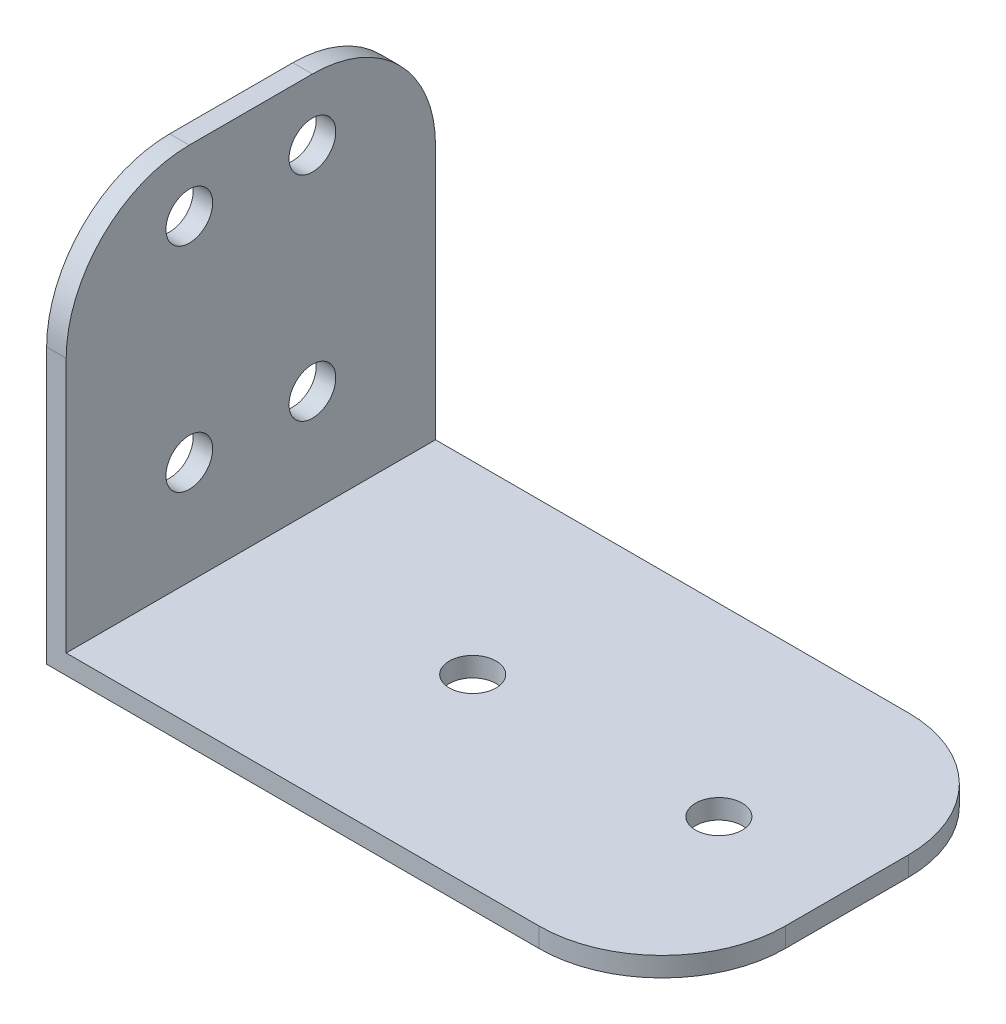
ISO-10303-21;
HEADER;
FILE_DESCRIPTION(('STEP AP214'),'2;1');
FILE_NAME('part.step','',(''),(''),'','','');
FILE_SCHEMA(('AUTOMOTIVE_DESIGN { 1 0 10303 214 1 1 1 1 }'));
ENDSEC;
DATA;
#1=APPLICATION_CONTEXT('core data for automotive mechanical design processes');
#2=APPLICATION_PROTOCOL_DEFINITION('international standard','automotive_design',2000,#1);
#3=PRODUCT_CONTEXT('',#1,'mechanical');
#4=PRODUCT('Part','Part','',(#3));
#5=PRODUCT_RELATED_PRODUCT_CATEGORY('part','',(#4));
#6=PRODUCT_DEFINITION_FORMATION('','',#4);
#7=PRODUCT_DEFINITION_CONTEXT('part definition',#1,'design');
#8=PRODUCT_DEFINITION('design','',#6,#7);
#9=PRODUCT_DEFINITION_SHAPE('','',#8);
#10=(LENGTH_UNIT() NAMED_UNIT(*) SI_UNIT(.MILLI.,.METRE.));
#11=(NAMED_UNIT(*) PLANE_ANGLE_UNIT() SI_UNIT($,.RADIAN.));
#12=(NAMED_UNIT(*) SI_UNIT($,.STERADIAN.) SOLID_ANGLE_UNIT());
#13=UNCERTAINTY_MEASURE_WITH_UNIT(LENGTH_MEASURE(1.E-05),#10,'distance_accuracy_value','');
#14=(GEOMETRIC_REPRESENTATION_CONTEXT(3) GLOBAL_UNCERTAINTY_ASSIGNED_CONTEXT((#13)) GLOBAL_UNIT_ASSIGNED_CONTEXT((#10,
#11,#12)) REPRESENTATION_CONTEXT('',''));
#15=CARTESIAN_POINT('',(0.,0.,0.));
#16=DIRECTION('',(0.,0.,1.));
#17=DIRECTION('',(1.,0.,0.));
#18=AXIS2_PLACEMENT_3D('',#15,#16,#17);
#19=CARTESIAN_POINT('',(0.,0.,15.));
#20=DIRECTION('',(1.,0.,0.));
#21=DIRECTION('',(0.,0.,-1.));
#22=AXIS2_PLACEMENT_3D('',#19,#20,#21);
#23=PLANE('',#22);
#24=CARTESIAN_POINT('',(0.,27.32,-5.));
#25=DIRECTION('',(-1.,0.,0.));
#26=DIRECTION('',(0.,0.,1.));
#27=AXIS2_PLACEMENT_3D('',#24,#25,#26);
#28=CIRCLE('',#27,1.89864999999999);
#29=CARTESIAN_POINT('',(0.,27.32,-3.10135000000001));
#30=VERTEX_POINT('',#29);
#31=EDGE_CURVE('E289',#30,#30,#28,.T.);
#32=ORIENTED_EDGE('',*,*,#31,.F.);
#33=EDGE_LOOP('',(#32));
#34=FACE_BOUND('',#33,.T.);
#35=CARTESIAN_POINT('',(0.,10.,5.));
#36=DIRECTION('',(-1.,0.,0.));
#37=DIRECTION('',(0.,0.,1.));
#38=AXIS2_PLACEMENT_3D('',#35,#36,#37);
#39=CIRCLE('',#38,1.89864999999999);
#40=CARTESIAN_POINT('',(0.,10.,6.89864999999999));
#41=VERTEX_POINT('',#40);
#42=EDGE_CURVE('E293',#41,#41,#39,.T.);
#43=ORIENTED_EDGE('',*,*,#42,.F.);
#44=EDGE_LOOP('',(#43));
#45=FACE_BOUND('',#44,.T.);
#46=CARTESIAN_POINT('',(0.,27.32,5.));
#47=DIRECTION('',(-1.,0.,0.));
#48=DIRECTION('',(0.,0.,1.));
#49=AXIS2_PLACEMENT_3D('',#46,#47,#48);
#50=CIRCLE('',#49,1.89864999999999);
#51=CARTESIAN_POINT('',(0.,27.32,6.89864999999999));
#52=VERTEX_POINT('',#51);
#53=EDGE_CURVE('E299',#52,#52,#50,.T.);
#54=ORIENTED_EDGE('',*,*,#53,.F.);
#55=EDGE_LOOP('',(#54));
#56=FACE_BOUND('',#55,.T.);
#57=CARTESIAN_POINT('',(0.,10.,-5.));
#58=DIRECTION('',(-1.,0.,0.));
#59=DIRECTION('',(0.,0.,1.));
#60=AXIS2_PLACEMENT_3D('',#57,#58,#59);
#61=CIRCLE('',#60,1.89864999999999);
#62=CARTESIAN_POINT('',(0.,10.,-3.10135000000001));
#63=VERTEX_POINT('',#62);
#64=EDGE_CURVE('E305',#63,#63,#61,.T.);
#65=ORIENTED_EDGE('',*,*,#64,.F.);
#66=EDGE_LOOP('',(#65));
#67=FACE_BOUND('',#66,.T.);
#68=DIRECTION('',(0.,-1.,0.));
#69=VECTOR('',#68,1.);
#70=CARTESIAN_POINT('',(0.,0.,15.));
#71=LINE('',#70,#69);
#72=CARTESIAN_POINT('',(0.,22.32,15.));
#73=VERTEX_POINT('',#72);
#74=CARTESIAN_POINT('',(0.,0.,15.));
#75=VERTEX_POINT('',#74);
#76=EDGE_CURVE('E113',#73,#75,#71,.T.);
#77=ORIENTED_EDGE('',*,*,#76,.F.);
#78=CARTESIAN_POINT('',(0.,22.32,5.));
#79=DIRECTION('',(1.,0.,0.));
#80=DIRECTION('',(0.,0.,-1.));
#81=AXIS2_PLACEMENT_3D('',#78,#79,#80);
#82=CIRCLE('',#81,10.);
#83=CARTESIAN_POINT('',(0.,32.32,5.));
#84=VERTEX_POINT('',#83);
#85=EDGE_CURVE('E167',#73,#84,#82,.F.);
#86=ORIENTED_EDGE('',*,*,#85,.T.);
#87=DIRECTION('',(0.,0.,-1.));
#88=VECTOR('',#87,1.);
#89=CARTESIAN_POINT('',(0.,32.32,15.));
#90=LINE('',#89,#88);
#91=CARTESIAN_POINT('',(0.,32.32,-5.));
#92=VERTEX_POINT('',#91);
#93=EDGE_CURVE('E175',#84,#92,#90,.T.);
#94=ORIENTED_EDGE('',*,*,#93,.T.);
#95=CARTESIAN_POINT('',(0.,22.32,-5.));
#96=DIRECTION('',(1.,0.,0.));
#97=DIRECTION('',(0.,0.,-1.));
#98=AXIS2_PLACEMENT_3D('',#95,#96,#97);
#99=CIRCLE('',#98,10.);
#100=CARTESIAN_POINT('',(0.,22.32,-15.));
#101=VERTEX_POINT('',#100);
#102=EDGE_CURVE('E165',#92,#101,#99,.F.);
#103=ORIENTED_EDGE('',*,*,#102,.T.);
#104=DIRECTION('',(0.,-1.,0.));
#105=VECTOR('',#104,1.);
#106=CARTESIAN_POINT('',(0.,0.,-15.));
#107=LINE('',#106,#105);
#108=CARTESIAN_POINT('',(0.,0.,-15.));
#109=VERTEX_POINT('',#108);
#110=EDGE_CURVE('E137',#101,#109,#107,.T.);
#111=ORIENTED_EDGE('',*,*,#110,.T.);
#112=DIRECTION('',(0.,0.,-1.));
#113=VECTOR('',#112,1.);
#114=CARTESIAN_POINT('',(0.,0.,15.));
#115=LINE('',#114,#113);
#116=EDGE_CURVE('E130',#75,#109,#115,.T.);
#117=ORIENTED_EDGE('',*,*,#116,.F.);
#118=EDGE_LOOP('',(#77,#86,#94,#103,#111,#117));
#119=FACE_BOUND('',#118,.T.);
#120=ADVANCED_FACE('F35',(#34,#45,#56,#67,#119),#23,.F.);
#121=CARTESIAN_POINT('',(0.,0.,15.));
#122=DIRECTION('',(0.,1.,0.));
#123=DIRECTION('',(0.,0.,1.));
#124=AXIS2_PLACEMENT_3D('',#121,#122,#123);
#125=PLANE('',#124);
#126=CARTESIAN_POINT('',(19.61,0.,0.));
#127=DIRECTION('',(0.,-1.,0.));
#128=DIRECTION('',(0.,0.,-1.));
#129=AXIS2_PLACEMENT_3D('',#126,#127,#128);
#130=CIRCLE('',#129,1.89864999999999);
#131=CARTESIAN_POINT('',(19.61,0.,-1.89864999999999));
#132=VERTEX_POINT('',#131);
#133=EDGE_CURVE('E276',#132,#132,#130,.T.);
#134=ORIENTED_EDGE('',*,*,#133,.F.);
#135=EDGE_LOOP('',(#134));
#136=FACE_BOUND('',#135,.T.);
#137=CARTESIAN_POINT('',(39.61,0.,0.));
#138=DIRECTION('',(0.,-1.,0.));
#139=DIRECTION('',(0.,0.,-1.));
#140=AXIS2_PLACEMENT_3D('',#137,#138,#139);
#141=CIRCLE('',#140,1.89864999999999);
#142=CARTESIAN_POINT('',(39.61,0.,-1.89864999999999));
#143=VERTEX_POINT('',#142);
#144=EDGE_CURVE('E280',#143,#143,#141,.T.);
#145=ORIENTED_EDGE('',*,*,#144,.F.);
#146=EDGE_LOOP('',(#145));
#147=FACE_BOUND('',#146,.T.);
#148=DIRECTION('',(1.,0.,0.));
#149=VECTOR('',#148,1.);
#150=CARTESIAN_POINT('',(0.,0.,-15.));
#151=LINE('',#150,#149);
#152=CARTESIAN_POINT('',(40.,0.,-15.));
#153=VERTEX_POINT('',#152);
#154=EDGE_CURVE('E204',#109,#153,#151,.T.);
#155=ORIENTED_EDGE('',*,*,#154,.T.);
#156=CARTESIAN_POINT('',(40.,0.,-5.));
#157=DIRECTION('',(0.,1.,0.));
#158=DIRECTION('',(0.,0.,1.));
#159=AXIS2_PLACEMENT_3D('',#156,#157,#158);
#160=CIRCLE('',#159,10.);
#161=CARTESIAN_POINT('',(50.,0.,-5.));
#162=VERTEX_POINT('',#161);
#163=EDGE_CURVE('E160',#153,#162,#160,.F.);
#164=ORIENTED_EDGE('',*,*,#163,.T.);
#165=DIRECTION('',(0.,0.,-1.));
#166=VECTOR('',#165,1.);
#167=CARTESIAN_POINT('',(50.,0.,15.));
#168=LINE('',#167,#166);
#169=CARTESIAN_POINT('',(50.,0.,5.));
#170=VERTEX_POINT('',#169);
#171=EDGE_CURVE('E140',#170,#162,#168,.T.);
#172=ORIENTED_EDGE('',*,*,#171,.F.);
#173=CARTESIAN_POINT('',(40.,0.,5.));
#174=DIRECTION('',(0.,1.,0.));
#175=DIRECTION('',(0.,0.,1.));
#176=AXIS2_PLACEMENT_3D('',#173,#174,#175);
#177=CIRCLE('',#176,10.);
#178=CARTESIAN_POINT('',(40.,0.,15.));
#179=VERTEX_POINT('',#178);
#180=EDGE_CURVE('E133',#170,#179,#177,.F.);
#181=ORIENTED_EDGE('',*,*,#180,.T.);
#182=DIRECTION('',(1.,0.,0.));
#183=VECTOR('',#182,1.);
#184=CARTESIAN_POINT('',(0.,0.,15.));
#185=LINE('',#184,#183);
#186=EDGE_CURVE('E117',#75,#179,#185,.T.);
#187=ORIENTED_EDGE('',*,*,#186,.F.);
#188=ORIENTED_EDGE('',*,*,#116,.T.);
#189=EDGE_LOOP('',(#155,#164,#172,#181,#187,#188));
#190=FACE_BOUND('',#189,.T.);
#191=ADVANCED_FACE('F129',(#136,#147,#190),#125,.F.);
#192=CARTESIAN_POINT('',(50.,1.5875,15.));
#193=DIRECTION('',(-1.,0.,0.));
#194=DIRECTION('',(0.,0.,1.));
#195=AXIS2_PLACEMENT_3D('',#192,#193,#194);
#196=PLANE('',#195);
#197=ORIENTED_EDGE('',*,*,#171,.T.);
#198=DIRECTION('',(0.,1.,0.));
#199=VECTOR('',#198,1.);
#200=CARTESIAN_POINT('',(50.,1.5875,-5.));
#201=LINE('',#200,#199);
#202=CARTESIAN_POINT('',(50.,1.5875,-5.));
#203=VERTEX_POINT('',#202);
#204=EDGE_CURVE('E142',#162,#203,#201,.T.);
#205=ORIENTED_EDGE('',*,*,#204,.T.);
#206=DIRECTION('',(0.,0.,-1.));
#207=VECTOR('',#206,1.);
#208=CARTESIAN_POINT('',(50.,1.5875,15.));
#209=LINE('',#208,#207);
#210=CARTESIAN_POINT('',(50.,1.5875,5.));
#211=VERTEX_POINT('',#210);
#212=EDGE_CURVE('E145',#211,#203,#209,.T.);
#213=ORIENTED_EDGE('',*,*,#212,.F.);
#214=DIRECTION('',(0.,1.,0.));
#215=VECTOR('',#214,1.);
#216=CARTESIAN_POINT('',(50.,1.5875,5.));
#217=LINE('',#216,#215);
#218=EDGE_CURVE('E139',#211,#170,#217,.F.);
#219=ORIENTED_EDGE('',*,*,#218,.T.);
#220=EDGE_LOOP('',(#197,#205,#213,#219));
#221=FACE_BOUND('',#220,.T.);
#222=ADVANCED_FACE('F195',(#221),#196,.F.);
#223=CARTESIAN_POINT('',(1.5875,1.5875,15.));
#224=DIRECTION('',(0.,-1.,0.));
#225=DIRECTION('',(0.,0.,-1.));
#226=AXIS2_PLACEMENT_3D('',#223,#224,#225);
#227=PLANE('',#226);
#228=CARTESIAN_POINT('',(19.61,1.5875,0.));
#229=DIRECTION('',(0.,-1.,0.));
#230=DIRECTION('',(0.,0.,-1.));
#231=AXIS2_PLACEMENT_3D('',#228,#229,#230);
#232=CIRCLE('',#231,1.89864999999999);
#233=CARTESIAN_POINT('',(19.61,1.5875,-1.89864999999999));
#234=VERTEX_POINT('',#233);
#235=EDGE_CURVE('E279',#234,#234,#232,.T.);
#236=ORIENTED_EDGE('',*,*,#235,.T.);
#237=EDGE_LOOP('',(#236));
#238=FACE_BOUND('',#237,.T.);
#239=CARTESIAN_POINT('',(39.61,1.5875,0.));
#240=DIRECTION('',(0.,-1.,0.));
#241=DIRECTION('',(0.,0.,-1.));
#242=AXIS2_PLACEMENT_3D('',#239,#240,#241);
#243=CIRCLE('',#242,1.89864999999999);
#244=CARTESIAN_POINT('',(39.61,1.5875,-1.89864999999999));
#245=VERTEX_POINT('',#244);
#246=EDGE_CURVE('E283',#245,#245,#243,.T.);
#247=ORIENTED_EDGE('',*,*,#246,.T.);
#248=EDGE_LOOP('',(#247));
#249=FACE_BOUND('',#248,.T.);
#250=ORIENTED_EDGE('',*,*,#212,.T.);
#251=CARTESIAN_POINT('',(40.,1.5875,-5.));
#252=DIRECTION('',(0.,-1.,0.));
#253=DIRECTION('',(0.,0.,-1.));
#254=AXIS2_PLACEMENT_3D('',#251,#252,#253);
#255=CIRCLE('',#254,10.);
#256=CARTESIAN_POINT('',(40.,1.5875,-15.));
#257=VERTEX_POINT('',#256);
#258=EDGE_CURVE('E153',#203,#257,#255,.F.);
#259=ORIENTED_EDGE('',*,*,#258,.T.);
#260=DIRECTION('',(-1.,0.,0.));
#261=VECTOR('',#260,1.);
#262=CARTESIAN_POINT('',(1.5875,1.5875,-15.));
#263=LINE('',#262,#261);
#264=CARTESIAN_POINT('',(1.5875,1.5875,-15.));
#265=VERTEX_POINT('',#264);
#266=EDGE_CURVE('E206',#257,#265,#263,.T.);
#267=ORIENTED_EDGE('',*,*,#266,.T.);
#268=DIRECTION('',(0.,0.,-1.));
#269=VECTOR('',#268,1.);
#270=CARTESIAN_POINT('',(1.5875,1.5875,15.));
#271=LINE('',#270,#269);
#272=CARTESIAN_POINT('',(1.5875,1.5875,15.));
#273=VERTEX_POINT('',#272);
#274=EDGE_CURVE('E180',#273,#265,#271,.T.);
#275=ORIENTED_EDGE('',*,*,#274,.F.);
#276=DIRECTION('',(-1.,0.,0.));
#277=VECTOR('',#276,1.);
#278=CARTESIAN_POINT('',(1.5875,1.5875,15.));
#279=LINE('',#278,#277);
#280=CARTESIAN_POINT('',(40.,1.5875,15.));
#281=VERTEX_POINT('',#280);
#282=EDGE_CURVE('E134',#281,#273,#279,.T.);
#283=ORIENTED_EDGE('',*,*,#282,.F.);
#284=CARTESIAN_POINT('',(40.,1.5875,5.));
#285=DIRECTION('',(0.,-1.,0.));
#286=DIRECTION('',(0.,0.,-1.));
#287=AXIS2_PLACEMENT_3D('',#284,#285,#286);
#288=CIRCLE('',#287,10.);
#289=EDGE_CURVE('E151',#281,#211,#288,.F.);
#290=ORIENTED_EDGE('',*,*,#289,.T.);
#291=EDGE_LOOP('',(#250,#259,#267,#275,#283,#290));
#292=FACE_BOUND('',#291,.T.);
#293=ADVANCED_FACE('F190',(#238,#249,#292),#227,.F.);
#294=CARTESIAN_POINT('',(1.5875,1.5875,15.));
#295=DIRECTION('',(-1.,0.,0.));
#296=DIRECTION('',(0.,0.,1.));
#297=AXIS2_PLACEMENT_3D('',#294,#295,#296);
#298=PLANE('',#297);
#299=CARTESIAN_POINT('',(1.5875,27.32,-5.));
#300=DIRECTION('',(-1.,0.,0.));
#301=DIRECTION('',(0.,0.,1.));
#302=AXIS2_PLACEMENT_3D('',#299,#300,#301);
#303=CIRCLE('',#302,1.89864999999999);
#304=CARTESIAN_POINT('',(1.5875,27.32,-3.10135000000001));
#305=VERTEX_POINT('',#304);
#306=EDGE_CURVE('E290',#305,#305,#303,.F.);
#307=ORIENTED_EDGE('',*,*,#306,.F.);
#308=EDGE_LOOP('',(#307));
#309=FACE_BOUND('',#308,.T.);
#310=CARTESIAN_POINT('',(1.5875,10.,5.));
#311=DIRECTION('',(-1.,0.,0.));
#312=DIRECTION('',(0.,0.,1.));
#313=AXIS2_PLACEMENT_3D('',#310,#311,#312);
#314=CIRCLE('',#313,1.89864999999999);
#315=CARTESIAN_POINT('',(1.5875,10.,6.89865));
#316=VERTEX_POINT('',#315);
#317=EDGE_CURVE('E296',#316,#316,#314,.F.);
#318=ORIENTED_EDGE('',*,*,#317,.F.);
#319=EDGE_LOOP('',(#318));
#320=FACE_BOUND('',#319,.T.);
#321=CARTESIAN_POINT('',(1.5875,27.32,5.));
#322=DIRECTION('',(-1.,0.,0.));
#323=DIRECTION('',(0.,0.,1.));
#324=AXIS2_PLACEMENT_3D('',#321,#322,#323);
#325=CIRCLE('',#324,1.89864999999999);
#326=CARTESIAN_POINT('',(1.5875,27.32,6.89865));
#327=VERTEX_POINT('',#326);
#328=EDGE_CURVE('E302',#327,#327,#325,.F.);
#329=ORIENTED_EDGE('',*,*,#328,.F.);
#330=EDGE_LOOP('',(#329));
#331=FACE_BOUND('',#330,.T.);
#332=CARTESIAN_POINT('',(1.5875,10.,-5.));
#333=DIRECTION('',(-1.,0.,0.));
#334=DIRECTION('',(0.,0.,1.));
#335=AXIS2_PLACEMENT_3D('',#332,#333,#334);
#336=CIRCLE('',#335,1.89864999999999);
#337=CARTESIAN_POINT('',(1.5875,10.,-3.10135));
#338=VERTEX_POINT('',#337);
#339=EDGE_CURVE('E205',#338,#338,#336,.F.);
#340=ORIENTED_EDGE('',*,*,#339,.F.);
#341=EDGE_LOOP('',(#340));
#342=FACE_BOUND('',#341,.T.);
#343=DIRECTION('',(0.,0.,-1.));
#344=VECTOR('',#343,1.);
#345=CARTESIAN_POINT('',(1.5875,32.32,15.));
#346=LINE('',#345,#344);
#347=CARTESIAN_POINT('',(1.5875,32.32,5.));
#348=VERTEX_POINT('',#347);
#349=CARTESIAN_POINT('',(1.5875,32.32,-5.));
#350=VERTEX_POINT('',#349);
#351=EDGE_CURVE('E176',#348,#350,#346,.T.);
#352=ORIENTED_EDGE('',*,*,#351,.F.);
#353=CARTESIAN_POINT('',(1.5875,22.32,5.));
#354=DIRECTION('',(-1.,0.,0.));
#355=DIRECTION('',(0.,0.,1.));
#356=AXIS2_PLACEMENT_3D('',#353,#354,#355);
#357=CIRCLE('',#356,10.);
#358=CARTESIAN_POINT('',(1.5875,22.32,15.));
#359=VERTEX_POINT('',#358);
#360=EDGE_CURVE('E11',#348,#359,#357,.F.);
#361=ORIENTED_EDGE('',*,*,#360,.T.);
#362=DIRECTION('',(0.,1.,0.));
#363=VECTOR('',#362,1.);
#364=CARTESIAN_POINT('',(1.5875,1.5875,15.));
#365=LINE('',#364,#363);
#366=EDGE_CURVE('E178',#273,#359,#365,.T.);
#367=ORIENTED_EDGE('',*,*,#366,.F.);
#368=ORIENTED_EDGE('',*,*,#274,.T.);
#369=DIRECTION('',(0.,1.,0.));
#370=VECTOR('',#369,1.);
#371=CARTESIAN_POINT('',(1.5875,1.5875,-15.));
#372=LINE('',#371,#370);
#373=CARTESIAN_POINT('',(1.5875,22.32,-15.));
#374=VERTEX_POINT('',#373);
#375=EDGE_CURVE('E124',#265,#374,#372,.T.);
#376=ORIENTED_EDGE('',*,*,#375,.T.);
#377=CARTESIAN_POINT('',(1.5875,22.32,-5.));
#378=DIRECTION('',(-1.,0.,0.));
#379=DIRECTION('',(0.,0.,1.));
#380=AXIS2_PLACEMENT_3D('',#377,#378,#379);
#381=CIRCLE('',#380,10.);
#382=EDGE_CURVE('E43',#374,#350,#381,.F.);
#383=ORIENTED_EDGE('',*,*,#382,.T.);
#384=EDGE_LOOP('',(#352,#361,#367,#368,#376,#383));
#385=FACE_BOUND('',#384,.T.);
#386=ADVANCED_FACE('F208',(#309,#320,#331,#342,#385),#298,.F.);
#387=CARTESIAN_POINT('',(0.,32.32,15.));
#388=DIRECTION('',(0.,-1.,0.));
#389=DIRECTION('',(0.,0.,-1.));
#390=AXIS2_PLACEMENT_3D('',#387,#388,#389);
#391=PLANE('',#390);
#392=ORIENTED_EDGE('',*,*,#93,.F.);
#393=DIRECTION('',(-1.,0.,0.));
#394=VECTOR('',#393,1.);
#395=CARTESIAN_POINT('',(0.,32.32,5.));
#396=LINE('',#395,#394);
#397=EDGE_CURVE('E56',#84,#348,#396,.F.);
#398=ORIENTED_EDGE('',*,*,#397,.T.);
#399=ORIENTED_EDGE('',*,*,#351,.T.);
#400=DIRECTION('',(-1.,0.,0.));
#401=VECTOR('',#400,1.);
#402=CARTESIAN_POINT('',(0.,32.32,-5.));
#403=LINE('',#402,#401);
#404=EDGE_CURVE('E169',#350,#92,#403,.T.);
#405=ORIENTED_EDGE('',*,*,#404,.T.);
#406=EDGE_LOOP('',(#392,#398,#399,#405));
#407=FACE_BOUND('',#406,.T.);
#408=ADVANCED_FACE('F174',(#407),#391,.F.);
#409=CARTESIAN_POINT('',(0.,0.,15.));
#410=DIRECTION('',(0.,0.,-1.));
#411=DIRECTION('',(-1.,0.,0.));
#412=AXIS2_PLACEMENT_3D('',#409,#410,#411);
#413=PLANE('',#412);
#414=ORIENTED_EDGE('',*,*,#186,.T.);
#415=DIRECTION('',(0.,1.,0.));
#416=VECTOR('',#415,1.);
#417=CARTESIAN_POINT('',(40.,0.,15.));
#418=LINE('',#417,#416);
#419=EDGE_CURVE('E163',#179,#281,#418,.T.);
#420=ORIENTED_EDGE('',*,*,#419,.T.);
#421=ORIENTED_EDGE('',*,*,#282,.T.);
#422=ORIENTED_EDGE('',*,*,#366,.T.);
#423=DIRECTION('',(-1.,0.,0.));
#424=VECTOR('',#423,1.);
#425=CARTESIAN_POINT('',(0.,22.32,15.));
#426=LINE('',#425,#424);
#427=EDGE_CURVE('E121',#359,#73,#426,.T.);
#428=ORIENTED_EDGE('',*,*,#427,.T.);
#429=ORIENTED_EDGE('',*,*,#76,.T.);
#430=EDGE_LOOP('',(#414,#420,#421,#422,#428,#429));
#431=FACE_BOUND('',#430,.T.);
#432=ADVANCED_FACE('F115',(#431),#413,.F.);
#433=CARTESIAN_POINT('',(0.,0.,-15.));
#434=DIRECTION('',(0.,0.,-1.));
#435=DIRECTION('',(-1.,0.,0.));
#436=AXIS2_PLACEMENT_3D('',#433,#434,#435);
#437=PLANE('',#436);
#438=ORIENTED_EDGE('',*,*,#266,.F.);
#439=DIRECTION('',(0.,1.,0.));
#440=VECTOR('',#439,1.);
#441=CARTESIAN_POINT('',(40.,0.,-15.));
#442=LINE('',#441,#440);
#443=EDGE_CURVE('E157',#257,#153,#442,.F.);
#444=ORIENTED_EDGE('',*,*,#443,.T.);
#445=ORIENTED_EDGE('',*,*,#154,.F.);
#446=ORIENTED_EDGE('',*,*,#110,.F.);
#447=DIRECTION('',(-1.,0.,0.));
#448=VECTOR('',#447,1.);
#449=CARTESIAN_POINT('',(1.5875,22.32,-15.));
#450=LINE('',#449,#448);
#451=EDGE_CURVE('E155',#101,#374,#450,.F.);
#452=ORIENTED_EDGE('',*,*,#451,.T.);
#453=ORIENTED_EDGE('',*,*,#375,.F.);
#454=EDGE_LOOP('',(#438,#444,#445,#446,#452,#453));
#455=FACE_BOUND('',#454,.T.);
#456=ADVANCED_FACE('F211',(#455),#437,.T.);
#457=CARTESIAN_POINT('',(0.,10.,-5.));
#458=DIRECTION('',(-1.,0.,0.));
#459=DIRECTION('',(0.,0.,1.));
#460=AXIS2_PLACEMENT_3D('',#457,#458,#459);
#461=CYLINDRICAL_SURFACE('',#460,1.89864999999999);
#462=ORIENTED_EDGE('',*,*,#339,.T.);
#463=EDGE_LOOP('',(#462));
#464=FACE_BOUND('',#463,.T.);
#465=ORIENTED_EDGE('',*,*,#64,.T.);
#466=EDGE_LOOP('',(#465));
#467=FACE_BOUND('',#466,.T.);
#468=ADVANCED_FACE('F251',(#464,#467),#461,.F.);
#469=CARTESIAN_POINT('',(0.,27.32,5.));
#470=DIRECTION('',(-1.,0.,0.));
#471=DIRECTION('',(0.,0.,1.));
#472=AXIS2_PLACEMENT_3D('',#469,#470,#471);
#473=CYLINDRICAL_SURFACE('',#472,1.89864999999999);
#474=ORIENTED_EDGE('',*,*,#328,.T.);
#475=EDGE_LOOP('',(#474));
#476=FACE_BOUND('',#475,.T.);
#477=ORIENTED_EDGE('',*,*,#53,.T.);
#478=EDGE_LOOP('',(#477));
#479=FACE_BOUND('',#478,.T.);
#480=ADVANCED_FACE('F256',(#476,#479),#473,.F.);
#481=CARTESIAN_POINT('',(0.,10.,5.));
#482=DIRECTION('',(-1.,0.,0.));
#483=DIRECTION('',(0.,0.,1.));
#484=AXIS2_PLACEMENT_3D('',#481,#482,#483);
#485=CYLINDRICAL_SURFACE('',#484,1.89864999999999);
#486=ORIENTED_EDGE('',*,*,#317,.T.);
#487=EDGE_LOOP('',(#486));
#488=FACE_BOUND('',#487,.T.);
#489=ORIENTED_EDGE('',*,*,#42,.T.);
#490=EDGE_LOOP('',(#489));
#491=FACE_BOUND('',#490,.T.);
#492=ADVANCED_FACE('F225',(#488,#491),#485,.F.);
#493=CARTESIAN_POINT('',(0.,27.32,-5.));
#494=DIRECTION('',(-1.,0.,0.));
#495=DIRECTION('',(0.,0.,1.));
#496=AXIS2_PLACEMENT_3D('',#493,#494,#495);
#497=CYLINDRICAL_SURFACE('',#496,1.89864999999999);
#498=ORIENTED_EDGE('',*,*,#306,.T.);
#499=EDGE_LOOP('',(#498));
#500=FACE_BOUND('',#499,.T.);
#501=ORIENTED_EDGE('',*,*,#31,.T.);
#502=EDGE_LOOP('',(#501));
#503=FACE_BOUND('',#502,.T.);
#504=ADVANCED_FACE('F217',(#500,#503),#497,.F.);
#505=CARTESIAN_POINT('',(40.,1.5875,-5.));
#506=DIRECTION('',(0.,-1.,0.));
#507=DIRECTION('',(0.,0.,-1.));
#508=AXIS2_PLACEMENT_3D('',#505,#506,#507);
#509=CYLINDRICAL_SURFACE('',#508,10.);
#510=ORIENTED_EDGE('',*,*,#163,.F.);
#511=ORIENTED_EDGE('',*,*,#443,.F.);
#512=ORIENTED_EDGE('',*,*,#258,.F.);
#513=ORIENTED_EDGE('',*,*,#204,.F.);
#514=EDGE_LOOP('',(#510,#511,#512,#513));
#515=FACE_BOUND('',#514,.T.);
#516=ADVANCED_FACE('F215',(#515),#509,.T.);
#517=CARTESIAN_POINT('',(40.,0.,5.));
#518=DIRECTION('',(0.,1.,0.));
#519=DIRECTION('',(0.,0.,1.));
#520=AXIS2_PLACEMENT_3D('',#517,#518,#519);
#521=CYLINDRICAL_SURFACE('',#520,10.);
#522=ORIENTED_EDGE('',*,*,#180,.F.);
#523=ORIENTED_EDGE('',*,*,#218,.F.);
#524=ORIENTED_EDGE('',*,*,#289,.F.);
#525=ORIENTED_EDGE('',*,*,#419,.F.);
#526=EDGE_LOOP('',(#522,#523,#524,#525));
#527=FACE_BOUND('',#526,.T.);
#528=ADVANCED_FACE('F198',(#527),#521,.T.);
#529=CARTESIAN_POINT('',(0.,22.32,5.));
#530=DIRECTION('',(-1.,0.,0.));
#531=DIRECTION('',(0.,0.,1.));
#532=AXIS2_PLACEMENT_3D('',#529,#530,#531);
#533=CYLINDRICAL_SURFACE('',#532,10.);
#534=ORIENTED_EDGE('',*,*,#360,.F.);
#535=ORIENTED_EDGE('',*,*,#397,.F.);
#536=ORIENTED_EDGE('',*,*,#85,.F.);
#537=ORIENTED_EDGE('',*,*,#427,.F.);
#538=EDGE_LOOP('',(#534,#535,#536,#537));
#539=FACE_BOUND('',#538,.T.);
#540=ADVANCED_FACE('F223',(#539),#533,.T.);
#541=CARTESIAN_POINT('',(0.,22.32,-5.));
#542=DIRECTION('',(1.,0.,0.));
#543=DIRECTION('',(0.,0.,-1.));
#544=AXIS2_PLACEMENT_3D('',#541,#542,#543);
#545=CYLINDRICAL_SURFACE('',#544,10.);
#546=ORIENTED_EDGE('',*,*,#382,.F.);
#547=ORIENTED_EDGE('',*,*,#451,.F.);
#548=ORIENTED_EDGE('',*,*,#102,.F.);
#549=ORIENTED_EDGE('',*,*,#404,.F.);
#550=EDGE_LOOP('',(#546,#547,#548,#549));
#551=FACE_BOUND('',#550,.T.);
#552=ADVANCED_FACE('F37',(#551),#545,.T.);
#553=CARTESIAN_POINT('',(39.61,0.,0.));
#554=DIRECTION('',(0.,-1.,0.));
#555=DIRECTION('',(0.,0.,-1.));
#556=AXIS2_PLACEMENT_3D('',#553,#554,#555);
#557=CYLINDRICAL_SURFACE('',#556,1.89864999999999);
#558=ORIENTED_EDGE('',*,*,#144,.T.);
#559=EDGE_LOOP('',(#558));
#560=FACE_BOUND('',#559,.T.);
#561=ORIENTED_EDGE('',*,*,#246,.F.);
#562=EDGE_LOOP('',(#561));
#563=FACE_BOUND('',#562,.T.);
#564=ADVANCED_FACE('F264',(#560,#563),#557,.F.);
#565=CARTESIAN_POINT('',(19.61,0.,0.));
#566=DIRECTION('',(0.,-1.,0.));
#567=DIRECTION('',(0.,0.,-1.));
#568=AXIS2_PLACEMENT_3D('',#565,#566,#567);
#569=CYLINDRICAL_SURFACE('',#568,1.89864999999999);
#570=ORIENTED_EDGE('',*,*,#133,.T.);
#571=EDGE_LOOP('',(#570));
#572=FACE_BOUND('',#571,.T.);
#573=ORIENTED_EDGE('',*,*,#235,.F.);
#574=EDGE_LOOP('',(#573));
#575=FACE_BOUND('',#574,.T.);
#576=ADVANCED_FACE('F267',(#572,#575),#569,.F.);
#577=CLOSED_SHELL('',(#120,#191,#222,#293,#386,#408,#432,#456,#468,#480,#492,#504,#516,#528,
#540,#552,#564,#576));
#578=MANIFOLD_SOLID_BREP('B2',#577);
#579=ADVANCED_BREP_SHAPE_REPRESENTATION('',(#18,#578),#14);
#580=SHAPE_DEFINITION_REPRESENTATION(#9,#579);
ENDSEC;
END-ISO-10303-21;
